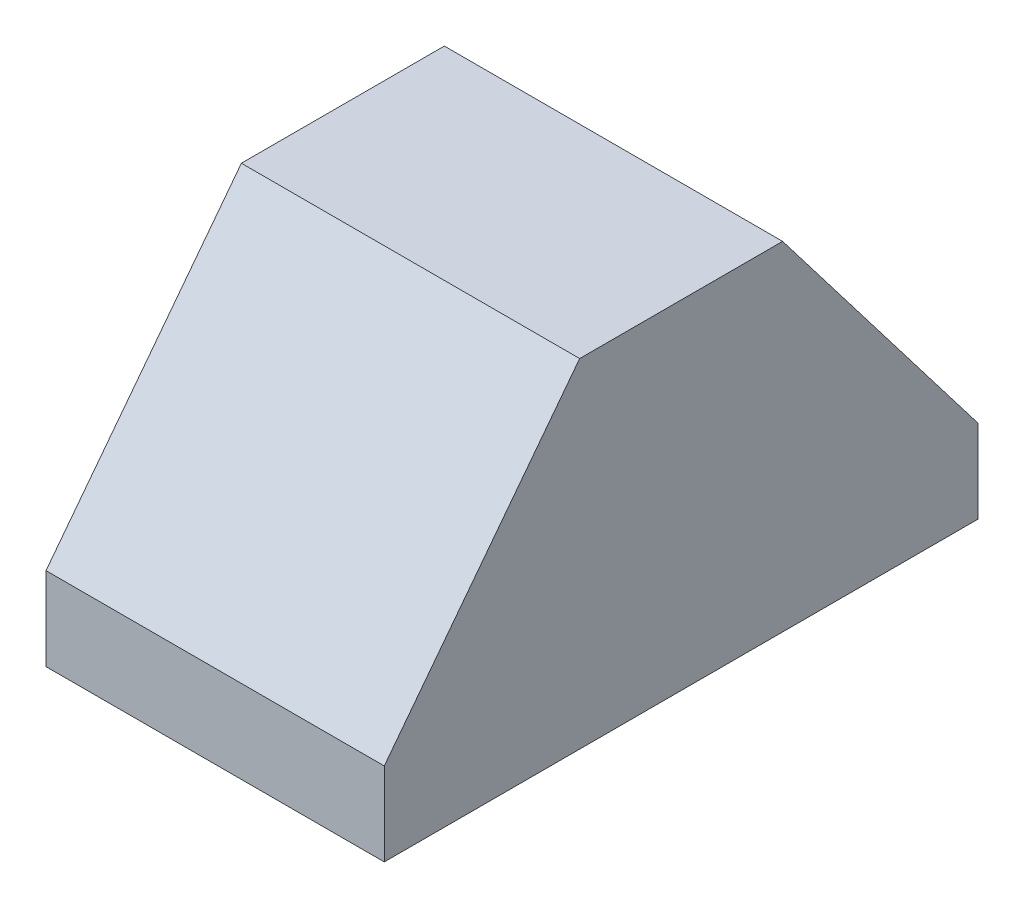
ISO-10303-21;
HEADER;
FILE_DESCRIPTION(('STEP AP214'),'2;1');
FILE_NAME('part.step','',(''),(''),'','','');
FILE_SCHEMA(('AUTOMOTIVE_DESIGN { 1 0 10303 214 1 1 1 1 }'));
ENDSEC;
DATA;
#1=APPLICATION_CONTEXT('core data for automotive mechanical design processes');
#2=APPLICATION_PROTOCOL_DEFINITION('international standard','automotive_design',2000,#1);
#3=PRODUCT_CONTEXT('',#1,'mechanical');
#4=PRODUCT('Part','Part','',(#3));
#5=PRODUCT_RELATED_PRODUCT_CATEGORY('part','',(#4));
#6=PRODUCT_DEFINITION_FORMATION('','',#4);
#7=PRODUCT_DEFINITION_CONTEXT('part definition',#1,'design');
#8=PRODUCT_DEFINITION('design','',#6,#7);
#9=PRODUCT_DEFINITION_SHAPE('','',#8);
#10=(LENGTH_UNIT() NAMED_UNIT(*) SI_UNIT(.MILLI.,.METRE.));
#11=(NAMED_UNIT(*) PLANE_ANGLE_UNIT() SI_UNIT($,.RADIAN.));
#12=(NAMED_UNIT(*) SI_UNIT($,.STERADIAN.) SOLID_ANGLE_UNIT());
#13=UNCERTAINTY_MEASURE_WITH_UNIT(LENGTH_MEASURE(1.E-05),#10,'distance_accuracy_value','');
#14=(GEOMETRIC_REPRESENTATION_CONTEXT(3) GLOBAL_UNCERTAINTY_ASSIGNED_CONTEXT((#13)) GLOBAL_UNIT_ASSIGNED_CONTEXT((#10,
#11,#12)) REPRESENTATION_CONTEXT('',''));
#15=CARTESIAN_POINT('',(0.,0.,0.));
#16=DIRECTION('',(0.,0.,1.));
#17=DIRECTION('',(1.,0.,0.));
#18=AXIS2_PLACEMENT_3D('',#15,#16,#17);
#19=CARTESIAN_POINT('',(50.,12.289828898642,0.));
#20=DIRECTION('',(0.,0.,-1.));
#21=DIRECTION('',(-1.,0.,0.));
#22=AXIS2_PLACEMENT_3D('',#19,#20,#21);
#23=PLANE('',#22);
#24=DIRECTION('',(0.,-1.,0.));
#25=VECTOR('',#24,1.);
#26=CARTESIAN_POINT('',(0.,12.289828898642,0.));
#27=LINE('',#26,#25);
#28=CARTESIAN_POINT('',(0.,12.289828898642,0.));
#29=VERTEX_POINT('',#28);
#30=CARTESIAN_POINT('',(0.,0.,0.));
#31=VERTEX_POINT('',#30);
#32=EDGE_CURVE('E128',#29,#31,#27,.T.);
#33=ORIENTED_EDGE('',*,*,#32,.T.);
#34=DIRECTION('',(-1.,0.,0.));
#35=VECTOR('',#34,1.);
#36=CARTESIAN_POINT('',(50.,0.,0.));
#37=LINE('',#36,#35);
#38=CARTESIAN_POINT('',(50.,0.,0.));
#39=VERTEX_POINT('',#38);
#40=EDGE_CURVE('E11',#39,#31,#37,.T.);
#41=ORIENTED_EDGE('',*,*,#40,.F.);
#42=DIRECTION('',(0.,-1.,0.));
#43=VECTOR('',#42,1.);
#44=CARTESIAN_POINT('',(50.,12.289828898642,0.));
#45=LINE('',#44,#43);
#46=CARTESIAN_POINT('',(50.,12.289828898642,0.));
#47=VERTEX_POINT('',#46);
#48=EDGE_CURVE('E144',#47,#39,#45,.T.);
#49=ORIENTED_EDGE('',*,*,#48,.F.);
#50=DIRECTION('',(-1.,0.,0.));
#51=VECTOR('',#50,1.);
#52=CARTESIAN_POINT('',(50.,12.289828898642,0.));
#53=LINE('',#52,#51);
#54=EDGE_CURVE('E124',#47,#29,#53,.T.);
#55=ORIENTED_EDGE('',*,*,#54,.T.);
#56=EDGE_LOOP('',(#33,#41,#49,#55));
#57=FACE_BOUND('',#56,.T.);
#58=ADVANCED_FACE('F39',(#57),#23,.F.);
#59=CARTESIAN_POINT('',(50.,0.,0.));
#60=DIRECTION('',(0.,1.,0.));
#61=DIRECTION('',(0.,0.,1.));
#62=AXIS2_PLACEMENT_3D('',#59,#60,#61);
#63=PLANE('',#62);
#64=DIRECTION('',(0.,0.,-1.));
#65=VECTOR('',#64,1.);
#66=CARTESIAN_POINT('',(0.,0.,0.));
#67=LINE('',#66,#65);
#68=CARTESIAN_POINT('',(0.,0.,-87.7586534106821));
#69=VERTEX_POINT('',#68);
#70=EDGE_CURVE('E132',#31,#69,#67,.T.);
#71=ORIENTED_EDGE('',*,*,#70,.T.);
#72=DIRECTION('',(-1.,0.,0.));
#73=VECTOR('',#72,1.);
#74=CARTESIAN_POINT('',(50.,0.,-87.7586534106821));
#75=LINE('',#74,#73);
#76=CARTESIAN_POINT('',(50.,0.,-87.7586534106821));
#77=VERTEX_POINT('',#76);
#78=EDGE_CURVE('E48',#77,#69,#75,.T.);
#79=ORIENTED_EDGE('',*,*,#78,.F.);
#80=DIRECTION('',(0.,0.,-1.));
#81=VECTOR('',#80,1.);
#82=CARTESIAN_POINT('',(50.,0.,0.));
#83=LINE('',#82,#81);
#84=EDGE_CURVE('E93',#39,#77,#83,.T.);
#85=ORIENTED_EDGE('',*,*,#84,.F.);
#86=ORIENTED_EDGE('',*,*,#40,.T.);
#87=EDGE_LOOP('',(#71,#79,#85,#86));
#88=FACE_BOUND('',#87,.T.);
#89=ADVANCED_FACE('F172',(#88),#63,.F.);
#90=CARTESIAN_POINT('',(50.,0.,-87.7586534106821));
#91=DIRECTION('',(0.,0.,1.));
#92=DIRECTION('',(1.,0.,0.));
#93=AXIS2_PLACEMENT_3D('',#90,#91,#92);
#94=PLANE('',#93);
#95=DIRECTION('',(0.,1.,0.));
#96=VECTOR('',#95,1.);
#97=CARTESIAN_POINT('',(0.,0.,-87.7586534106821));
#98=LINE('',#97,#96);
#99=CARTESIAN_POINT('',(0.,12.289828898642,-87.7586534106821));
#100=VERTEX_POINT('',#99);
#101=EDGE_CURVE('E135',#69,#100,#98,.T.);
#102=ORIENTED_EDGE('',*,*,#101,.T.);
#103=DIRECTION('',(-1.,0.,0.));
#104=VECTOR('',#103,1.);
#105=CARTESIAN_POINT('',(50.,12.289828898642,-87.7586534106821));
#106=LINE('',#105,#104);
#107=CARTESIAN_POINT('',(50.,12.289828898642,-87.7586534106821));
#108=VERTEX_POINT('',#107);
#109=EDGE_CURVE('E117',#108,#100,#106,.T.);
#110=ORIENTED_EDGE('',*,*,#109,.F.);
#111=DIRECTION('',(0.,1.,0.));
#112=VECTOR('',#111,1.);
#113=CARTESIAN_POINT('',(50.,0.,-87.7586534106821));
#114=LINE('',#113,#112);
#115=EDGE_CURVE('E106',#77,#108,#114,.T.);
#116=ORIENTED_EDGE('',*,*,#115,.F.);
#117=ORIENTED_EDGE('',*,*,#78,.T.);
#118=EDGE_LOOP('',(#102,#110,#116,#117));
#119=FACE_BOUND('',#118,.T.);
#120=ADVANCED_FACE('F154',(#119),#94,.F.);
#121=CARTESIAN_POINT('',(50.,12.289828898642,-87.7586534106821));
#122=DIRECTION('',(0.,-0.608009739937123,0.793929566234683));
#123=DIRECTION('',(0.,-0.793929566234683,-0.608009739937123));
#124=AXIS2_PLACEMENT_3D('',#121,#122,#123);
#125=PLANE('',#124);
#126=DIRECTION('',(0.,0.793929566234683,0.608009739937123));
#127=VECTOR('',#126,1.);
#128=CARTESIAN_POINT('',(0.,12.289828898642,-87.7586534106821));
#129=LINE('',#128,#127);
#130=CARTESIAN_POINT('',(0.,50.,-58.8793267053411));
#131=VERTEX_POINT('',#130);
#132=EDGE_CURVE('E115',#100,#131,#129,.T.);
#133=ORIENTED_EDGE('',*,*,#132,.T.);
#134=DIRECTION('',(-1.,0.,0.));
#135=VECTOR('',#134,1.);
#136=CARTESIAN_POINT('',(50.,50.,-58.8793267053411));
#137=LINE('',#136,#135);
#138=CARTESIAN_POINT('',(50.,50.,-58.8793267053411));
#139=VERTEX_POINT('',#138);
#140=EDGE_CURVE('E112',#139,#131,#137,.T.);
#141=ORIENTED_EDGE('',*,*,#140,.F.);
#142=DIRECTION('',(0.,0.793929566234683,0.608009739937123));
#143=VECTOR('',#142,1.);
#144=CARTESIAN_POINT('',(50.,12.289828898642,-87.7586534106821));
#145=LINE('',#144,#143);
#146=EDGE_CURVE('E100',#108,#139,#145,.T.);
#147=ORIENTED_EDGE('',*,*,#146,.F.);
#148=ORIENTED_EDGE('',*,*,#109,.T.);
#149=EDGE_LOOP('',(#133,#141,#147,#148));
#150=FACE_BOUND('',#149,.T.);
#151=ADVANCED_FACE('F113',(#150),#125,.F.);
#152=CARTESIAN_POINT('',(50.,50.,-58.8793267053411));
#153=DIRECTION('',(0.,-1.,0.));
#154=DIRECTION('',(0.,0.,-1.));
#155=AXIS2_PLACEMENT_3D('',#152,#153,#154);
#156=PLANE('',#155);
#157=DIRECTION('',(0.,0.,1.));
#158=VECTOR('',#157,1.);
#159=CARTESIAN_POINT('',(0.,50.,-58.8793267053411));
#160=LINE('',#159,#158);
#161=CARTESIAN_POINT('',(0.,50.,-28.8793267053411));
#162=VERTEX_POINT('',#161);
#163=EDGE_CURVE('E79',#131,#162,#160,.T.);
#164=ORIENTED_EDGE('',*,*,#163,.T.);
#165=DIRECTION('',(-1.,0.,0.));
#166=VECTOR('',#165,1.);
#167=CARTESIAN_POINT('',(50.,50.,-28.8793267053411));
#168=LINE('',#167,#166);
#169=CARTESIAN_POINT('',(50.,50.,-28.8793267053411));
#170=VERTEX_POINT('',#169);
#171=EDGE_CURVE('E118',#170,#162,#168,.T.);
#172=ORIENTED_EDGE('',*,*,#171,.F.);
#173=DIRECTION('',(0.,0.,1.));
#174=VECTOR('',#173,1.);
#175=CARTESIAN_POINT('',(50.,50.,-58.8793267053411));
#176=LINE('',#175,#174);
#177=EDGE_CURVE('E104',#139,#170,#176,.T.);
#178=ORIENTED_EDGE('',*,*,#177,.F.);
#179=ORIENTED_EDGE('',*,*,#140,.T.);
#180=EDGE_LOOP('',(#164,#172,#178,#179));
#181=FACE_BOUND('',#180,.T.);
#182=ADVANCED_FACE('F120',(#181),#156,.F.);
#183=CARTESIAN_POINT('',(50.,50.,-28.8793267053411));
#184=DIRECTION('',(0.,-0.608009739937124,-0.793929566234683));
#185=DIRECTION('',(0.,0.793929566234683,-0.608009739937124));
#186=AXIS2_PLACEMENT_3D('',#183,#184,#185);
#187=PLANE('',#186);
#188=DIRECTION('',(0.,-0.793929566234683,0.608009739937124));
#189=VECTOR('',#188,1.);
#190=CARTESIAN_POINT('',(0.,50.,-28.8793267053411));
#191=LINE('',#190,#189);
#192=EDGE_CURVE('E85',#162,#29,#191,.T.);
#193=ORIENTED_EDGE('',*,*,#192,.T.);
#194=ORIENTED_EDGE('',*,*,#54,.F.);
#195=DIRECTION('',(0.,-0.793929566234683,0.608009739937124));
#196=VECTOR('',#195,1.);
#197=CARTESIAN_POINT('',(50.,50.,-28.8793267053411));
#198=LINE('',#197,#196);
#199=EDGE_CURVE('E56',#170,#47,#198,.T.);
#200=ORIENTED_EDGE('',*,*,#199,.F.);
#201=ORIENTED_EDGE('',*,*,#171,.T.);
#202=EDGE_LOOP('',(#193,#194,#200,#201));
#203=FACE_BOUND('',#202,.T.);
#204=ADVANCED_FACE('F161',(#203),#187,.F.);
#205=CARTESIAN_POINT('',(50.,0.,0.));
#206=DIRECTION('',(1.,0.,0.));
#207=DIRECTION('',(0.,0.,-1.));
#208=AXIS2_PLACEMENT_3D('',#205,#206,#207);
#209=PLANE('',#208);
#210=ORIENTED_EDGE('',*,*,#48,.T.);
#211=ORIENTED_EDGE('',*,*,#84,.T.);
#212=ORIENTED_EDGE('',*,*,#115,.T.);
#213=ORIENTED_EDGE('',*,*,#146,.T.);
#214=ORIENTED_EDGE('',*,*,#177,.T.);
#215=ORIENTED_EDGE('',*,*,#199,.T.);
#216=EDGE_LOOP('',(#210,#211,#212,#213,#214,#215));
#217=FACE_BOUND('',#216,.T.);
#218=ADVANCED_FACE('F102',(#217),#209,.T.);
#219=CARTESIAN_POINT('',(0.,0.,0.));
#220=DIRECTION('',(1.,0.,0.));
#221=DIRECTION('',(0.,0.,-1.));
#222=AXIS2_PLACEMENT_3D('',#219,#220,#221);
#223=PLANE('',#222);
#224=ORIENTED_EDGE('',*,*,#32,.F.);
#225=ORIENTED_EDGE('',*,*,#192,.F.);
#226=ORIENTED_EDGE('',*,*,#163,.F.);
#227=ORIENTED_EDGE('',*,*,#132,.F.);
#228=ORIENTED_EDGE('',*,*,#101,.F.);
#229=ORIENTED_EDGE('',*,*,#70,.F.);
#230=EDGE_LOOP('',(#224,#225,#226,#227,#228,#229));
#231=FACE_BOUND('',#230,.T.);
#232=ADVANCED_FACE('F157',(#231),#223,.F.);
#233=CLOSED_SHELL('',(#58,#89,#120,#151,#182,#204,#218,#232));
#234=MANIFOLD_SOLID_BREP('B2',#233);
#235=ADVANCED_BREP_SHAPE_REPRESENTATION('',(#18,#234),#14);
#236=SHAPE_DEFINITION_REPRESENTATION(#9,#235);
ENDSEC;
END-ISO-10303-21;
